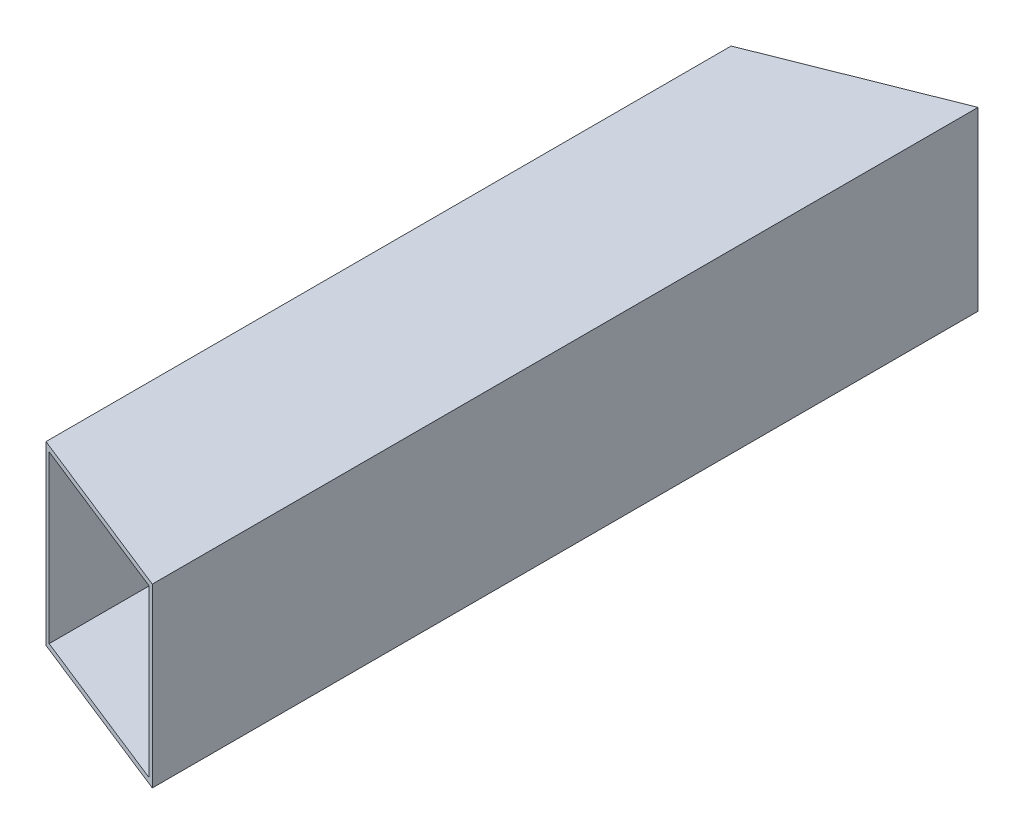
ISO-10303-21;
HEADER;
FILE_DESCRIPTION(('STEP AP214'),'2;1');
FILE_NAME('part.step','',(''),(''),'','','');
FILE_SCHEMA(('AUTOMOTIVE_DESIGN { 1 0 10303 214 1 1 1 1 }'));
ENDSEC;
DATA;
#1=APPLICATION_CONTEXT('core data for automotive mechanical design processes');
#2=APPLICATION_PROTOCOL_DEFINITION('international standard','automotive_design',2000,#1);
#3=PRODUCT_CONTEXT('',#1,'mechanical');
#4=PRODUCT('Part','Part','',(#3));
#5=PRODUCT_RELATED_PRODUCT_CATEGORY('part','',(#4));
#6=PRODUCT_DEFINITION_FORMATION('','',#4);
#7=PRODUCT_DEFINITION_CONTEXT('part definition',#1,'design');
#8=PRODUCT_DEFINITION('design','',#6,#7);
#9=PRODUCT_DEFINITION_SHAPE('','',#8);
#10=(LENGTH_UNIT() NAMED_UNIT(*) SI_UNIT(.MILLI.,.METRE.));
#11=(NAMED_UNIT(*) PLANE_ANGLE_UNIT() SI_UNIT($,.RADIAN.));
#12=(NAMED_UNIT(*) SI_UNIT($,.STERADIAN.) SOLID_ANGLE_UNIT());
#13=UNCERTAINTY_MEASURE_WITH_UNIT(LENGTH_MEASURE(1.E-05),#10,'distance_accuracy_value','');
#14=(GEOMETRIC_REPRESENTATION_CONTEXT(3) GLOBAL_UNCERTAINTY_ASSIGNED_CONTEXT((#13)) GLOBAL_UNIT_ASSIGNED_CONTEXT((#10,
#11,#12)) REPRESENTATION_CONTEXT('',''));
#15=CARTESIAN_POINT('',(0.,0.,0.));
#16=DIRECTION('',(0.,0.,1.));
#17=DIRECTION('',(1.,0.,0.));
#18=AXIS2_PLACEMENT_3D('',#15,#16,#17);
#19=CARTESIAN_POINT('',(-15.9452234480182,15.9452234480182,149.11688245));
#20=DIRECTION('',(0.,-1.,0.));
#21=DIRECTION('',(0.,0.,-1.));
#22=AXIS2_PLACEMENT_3D('',#19,#20,#21);
#23=PLANE('',#22);
#24=DIRECTION('',(0.,0.,-1.));
#25=VECTOR('',#24,1.);
#26=CARTESIAN_POINT('',(-15.9452234480182,15.9452234480182,149.11688245));
#27=LINE('',#26,#25);
#28=CARTESIAN_POINT('',(-15.9452234480182,15.9452234480182,136.424287616364));
#29=VERTEX_POINT('',#28);
#30=CARTESIAN_POINT('',(-15.9452234480182,15.9452234480182,12.6925948336361));
#31=VERTEX_POINT('',#30);
#32=EDGE_CURVE('E119',#29,#31,#27,.T.);
#33=ORIENTED_EDGE('',*,*,#32,.F.);
#34=DIRECTION('',(0.92911410701226,0.,0.369793153196229));
#35=VECTOR('',#34,1.);
#36=CARTESIAN_POINT('',(-11.5843012668873,15.9452234480182,138.159961579371));
#37=LINE('',#36,#35);
#38=CARTESIAN_POINT('',(15.9452234480182,15.9452259480182,149.11688245));
#39=VERTEX_POINT('',#38);
#40=EDGE_CURVE('E104',#29,#39,#37,.T.);
#41=ORIENTED_EDGE('',*,*,#40,.T.);
#42=DIRECTION('',(0.,0.,-1.));
#43=VECTOR('',#42,1.);
#44=CARTESIAN_POINT('',(15.9452234480182,15.9452234480182,149.11688245));
#45=LINE('',#44,#43);
#46=CARTESIAN_POINT('',(15.9452234480182,15.9452234480182,0.));
#47=VERTEX_POINT('',#46);
#48=EDGE_CURVE('E42',#39,#47,#45,.T.);
#49=ORIENTED_EDGE('',*,*,#48,.T.);
#50=DIRECTION('',(0.92911410701226,0.,-0.369793153196229));
#51=VECTOR('',#50,1.);
#52=CARTESIAN_POINT('',(-62.8178850045487,15.9452234480182,31.3482036387022));
#53=LINE('',#52,#51);
#54=EDGE_CURVE('E152',#31,#47,#53,.T.);
#55=ORIENTED_EDGE('',*,*,#54,.F.);
#56=EDGE_LOOP('',(#33,#41,#49,#55));
#57=FACE_BOUND('',#56,.T.);
#58=ADVANCED_FACE('F33',(#57),#23,.F.);
#59=CARTESIAN_POINT('',(-15.9452234480182,-15.9452234480182,149.11688245));
#60=DIRECTION('',(1.,0.,0.));
#61=DIRECTION('',(0.,0.,-1.));
#62=AXIS2_PLACEMENT_3D('',#59,#60,#61);
#63=PLANE('',#62);
#64=DIRECTION('',(0.,0.,-1.));
#65=VECTOR('',#64,1.);
#66=CARTESIAN_POINT('',(-15.9452234480182,-15.9452234480182,149.11688245));
#67=LINE('',#66,#65);
#68=CARTESIAN_POINT('',(-15.9452234480182,-15.9452234480182,136.424287616364));
#69=VERTEX_POINT('',#68);
#70=CARTESIAN_POINT('',(-15.9452234480182,-15.9452234480182,12.6925948336361));
#71=VERTEX_POINT('',#70);
#72=EDGE_CURVE('E123',#69,#71,#67,.T.);
#73=ORIENTED_EDGE('',*,*,#72,.F.);
#74=DIRECTION('',(0.,1.,0.));
#75=VECTOR('',#74,1.);
#76=CARTESIAN_POINT('',(-15.9452234480182,-15.9452484480182,136.424287616364));
#77=LINE('',#76,#75);
#78=EDGE_CURVE('E171',#69,#29,#77,.T.);
#79=ORIENTED_EDGE('',*,*,#78,.T.);
#80=ORIENTED_EDGE('',*,*,#32,.T.);
#81=DIRECTION('',(0.,1.,0.));
#82=VECTOR('',#81,1.);
#83=CARTESIAN_POINT('',(-15.9452234480182,-15.9452234480182,12.6925948336361));
#84=LINE('',#83,#82);
#85=EDGE_CURVE('E141',#71,#31,#84,.T.);
#86=ORIENTED_EDGE('',*,*,#85,.F.);
#87=EDGE_LOOP('',(#73,#79,#80,#86));
#88=FACE_BOUND('',#87,.T.);
#89=ADVANCED_FACE('F170',(#88),#63,.F.);
#90=CARTESIAN_POINT('',(-15.9452234480182,-15.9452234480182,149.11688245));
#91=DIRECTION('',(0.,1.,0.));
#92=DIRECTION('',(0.,0.,1.));
#93=AXIS2_PLACEMENT_3D('',#90,#91,#92);
#94=PLANE('',#93);
#95=DIRECTION('',(0.,0.,-1.));
#96=VECTOR('',#95,1.);
#97=CARTESIAN_POINT('',(15.9452234480182,-15.9452234480182,149.11688245));
#98=LINE('',#97,#96);
#99=CARTESIAN_POINT('',(15.9452234480182,-15.9452259480182,149.11688245));
#100=VERTEX_POINT('',#99);
#101=CARTESIAN_POINT('',(15.9452234480182,-15.9452234480182,0.));
#102=VERTEX_POINT('',#101);
#103=EDGE_CURVE('E112',#100,#102,#98,.T.);
#104=ORIENTED_EDGE('',*,*,#103,.F.);
#105=DIRECTION('',(-0.92911410701226,0.,-0.369793153196229));
#106=VECTOR('',#105,1.);
#107=CARTESIAN_POINT('',(-11.5843012668873,-15.9452234480182,138.159961579371));
#108=LINE('',#107,#106);
#109=EDGE_CURVE('E107',#100,#69,#108,.T.);
#110=ORIENTED_EDGE('',*,*,#109,.T.);
#111=ORIENTED_EDGE('',*,*,#72,.T.);
#112=DIRECTION('',(-0.92911410701226,0.,0.369793153196229));
#113=VECTOR('',#112,1.);
#114=CARTESIAN_POINT('',(2.18046109056548,-15.9452234480182,5.47846043531448));
#115=LINE('',#114,#113);
#116=EDGE_CURVE('E120',#102,#71,#115,.T.);
#117=ORIENTED_EDGE('',*,*,#116,.F.);
#118=EDGE_LOOP('',(#104,#110,#111,#117));
#119=FACE_BOUND('',#118,.T.);
#120=ADVANCED_FACE('F165',(#119),#94,.F.);
#121=CARTESIAN_POINT('',(15.,-15.,149.11688245));
#122=DIRECTION('',(-1.,0.,0.));
#123=DIRECTION('',(0.,0.,1.));
#124=AXIS2_PLACEMENT_3D('',#121,#122,#123);
#125=PLANE('',#124);
#126=DIRECTION('',(0.,-1.,0.));
#127=VECTOR('',#126,1.);
#128=CARTESIAN_POINT('',(15.,-15.,148.740677679585));
#129=LINE('',#128,#127);
#130=CARTESIAN_POINT('',(15.,15.,148.740677679585));
#131=VERTEX_POINT('',#130);
#132=CARTESIAN_POINT('',(15.,-15.,148.740677679585));
#133=VERTEX_POINT('',#132);
#134=EDGE_CURVE('E50',#131,#133,#129,.T.);
#135=ORIENTED_EDGE('',*,*,#134,.F.);
#136=DIRECTION('',(0.,0.,-1.));
#137=VECTOR('',#136,1.);
#138=CARTESIAN_POINT('',(15.,15.,149.11688245));
#139=LINE('',#138,#137);
#140=CARTESIAN_POINT('',(15.,15.,0.376204770414758));
#141=VERTEX_POINT('',#140);
#142=EDGE_CURVE('E129',#131,#141,#139,.T.);
#143=ORIENTED_EDGE('',*,*,#142,.T.);
#144=DIRECTION('',(0.,-1.,0.));
#145=VECTOR('',#144,1.);
#146=CARTESIAN_POINT('',(15.,-15.,0.376204770414751));
#147=LINE('',#146,#145);
#148=CARTESIAN_POINT('',(15.,-15.,0.376204770414758));
#149=VERTEX_POINT('',#148);
#150=EDGE_CURVE('E149',#141,#149,#147,.T.);
#151=ORIENTED_EDGE('',*,*,#150,.T.);
#152=DIRECTION('',(0.,0.,-1.));
#153=VECTOR('',#152,1.);
#154=CARTESIAN_POINT('',(15.,-15.,149.11688245));
#155=LINE('',#154,#153);
#156=EDGE_CURVE('E154',#133,#149,#155,.T.);
#157=ORIENTED_EDGE('',*,*,#156,.F.);
#158=EDGE_LOOP('',(#135,#143,#151,#157));
#159=FACE_BOUND('',#158,.T.);
#160=ADVANCED_FACE('F186',(#159),#125,.T.);
#161=CARTESIAN_POINT('',(-15.,15.,149.11688245));
#162=DIRECTION('',(0.,-1.,0.));
#163=DIRECTION('',(0.,0.,-1.));
#164=AXIS2_PLACEMENT_3D('',#161,#162,#163);
#165=PLANE('',#164);
#166=DIRECTION('',(0.92911410701226,0.,0.369793153196229));
#167=VECTOR('',#166,1.);
#168=CARTESIAN_POINT('',(-10.7683342671724,15.,138.484721485018));
#169=LINE('',#168,#167);
#170=CARTESIAN_POINT('',(-15.,15.,136.800492386779));
#171=VERTEX_POINT('',#170);
#172=EDGE_CURVE('E178',#171,#131,#169,.T.);
#173=ORIENTED_EDGE('',*,*,#172,.F.);
#174=DIRECTION('',(0.,0.,-1.));
#175=VECTOR('',#174,1.);
#176=CARTESIAN_POINT('',(-15.,15.,149.11688245));
#177=LINE('',#176,#175);
#178=CARTESIAN_POINT('',(-15.,15.,12.3163900632213));
#179=VERTEX_POINT('',#178);
#180=EDGE_CURVE('E159',#171,#179,#177,.T.);
#181=ORIENTED_EDGE('',*,*,#180,.T.);
#182=DIRECTION('',(0.92911410701226,0.,-0.369793153196229));
#183=VECTOR('',#182,1.);
#184=CARTESIAN_POINT('',(-62.0019180048338,15.,31.0234437330552));
#185=LINE('',#184,#183);
#186=EDGE_CURVE('E146',#179,#141,#185,.T.);
#187=ORIENTED_EDGE('',*,*,#186,.T.);
#188=ORIENTED_EDGE('',*,*,#142,.F.);
#189=EDGE_LOOP('',(#173,#181,#187,#188));
#190=FACE_BOUND('',#189,.T.);
#191=ADVANCED_FACE('F188',(#190),#165,.T.);
#192=CARTESIAN_POINT('',(-15.,-15.,149.11688245));
#193=DIRECTION('',(1.,0.,0.));
#194=DIRECTION('',(0.,0.,-1.));
#195=AXIS2_PLACEMENT_3D('',#192,#193,#194);
#196=PLANE('',#195);
#197=DIRECTION('',(0.,1.,0.));
#198=VECTOR('',#197,1.);
#199=CARTESIAN_POINT('',(-15.,-15.,136.800492386779));
#200=LINE('',#199,#198);
#201=CARTESIAN_POINT('',(-15.,-15.,136.800492386779));
#202=VERTEX_POINT('',#201);
#203=EDGE_CURVE('E174',#202,#171,#200,.T.);
#204=ORIENTED_EDGE('',*,*,#203,.F.);
#205=DIRECTION('',(0.,0.,-1.));
#206=VECTOR('',#205,1.);
#207=CARTESIAN_POINT('',(-15.,-15.,149.11688245));
#208=LINE('',#207,#206);
#209=CARTESIAN_POINT('',(-15.,-15.,12.3163900632213));
#210=VERTEX_POINT('',#209);
#211=EDGE_CURVE('E58',#202,#210,#208,.T.);
#212=ORIENTED_EDGE('',*,*,#211,.T.);
#213=DIRECTION('',(0.,1.,0.));
#214=VECTOR('',#213,1.);
#215=CARTESIAN_POINT('',(-15.,-15.,12.3163900632213));
#216=LINE('',#215,#214);
#217=EDGE_CURVE('E144',#210,#179,#216,.T.);
#218=ORIENTED_EDGE('',*,*,#217,.T.);
#219=ORIENTED_EDGE('',*,*,#180,.F.);
#220=EDGE_LOOP('',(#204,#212,#218,#219));
#221=FACE_BOUND('',#220,.T.);
#222=ADVANCED_FACE('F192',(#221),#196,.T.);
#223=CARTESIAN_POINT('',(-15.,-15.,149.11688245));
#224=DIRECTION('',(0.,1.,0.));
#225=DIRECTION('',(0.,0.,1.));
#226=AXIS2_PLACEMENT_3D('',#223,#224,#225);
#227=PLANE('',#226);
#228=DIRECTION('',(-0.92911410701226,0.,-0.369793153196229));
#229=VECTOR('',#228,1.);
#230=CARTESIAN_POINT('',(-10.7683342671724,-15.,138.484721485018));
#231=LINE('',#230,#229);
#232=EDGE_CURVE('E172',#133,#202,#231,.T.);
#233=ORIENTED_EDGE('',*,*,#232,.F.);
#234=ORIENTED_EDGE('',*,*,#156,.T.);
#235=DIRECTION('',(-0.92911410701226,0.,0.369793153196229));
#236=VECTOR('',#235,1.);
#237=CARTESIAN_POINT('',(-62.0019180048338,-15.,31.0234437330552));
#238=LINE('',#237,#236);
#239=EDGE_CURVE('E11',#149,#210,#238,.T.);
#240=ORIENTED_EDGE('',*,*,#239,.T.);
#241=ORIENTED_EDGE('',*,*,#211,.F.);
#242=EDGE_LOOP('',(#233,#234,#240,#241));
#243=FACE_BOUND('',#242,.T.);
#244=ADVANCED_FACE('F194',(#243),#227,.T.);
#245=CARTESIAN_POINT('',(15.9452234480182,-15.9452234480182,149.11688245));
#246=DIRECTION('',(-1.,0.,0.));
#247=DIRECTION('',(0.,0.,1.));
#248=AXIS2_PLACEMENT_3D('',#245,#246,#247);
#249=PLANE('',#248);
#250=DIRECTION('',(0.,1.,0.));
#251=VECTOR('',#250,1.);
#252=CARTESIAN_POINT('',(15.9452234480182,-15.9452234480182,0.));
#253=LINE('',#252,#251);
#254=EDGE_CURVE('E113',#102,#47,#253,.T.);
#255=ORIENTED_EDGE('',*,*,#254,.T.);
#256=ORIENTED_EDGE('',*,*,#48,.F.);
#257=DIRECTION('',(0.,1.,0.));
#258=VECTOR('',#257,1.);
#259=CARTESIAN_POINT('',(15.9452234480182,-15.9452234480182,149.11688245));
#260=LINE('',#259,#258);
#261=EDGE_CURVE('E101',#100,#39,#260,.T.);
#262=ORIENTED_EDGE('',*,*,#261,.F.);
#263=ORIENTED_EDGE('',*,*,#103,.T.);
#264=EDGE_LOOP('',(#255,#256,#262,#263));
#265=FACE_BOUND('',#264,.T.);
#266=ADVANCED_FACE('F35',(#265),#249,.F.);
#267=CARTESIAN_POINT('',(2.18046109056548,-15.9452234480182,5.47846043531448));
#268=DIRECTION('',(-0.369793153196229,0.,-0.92911410701226));
#269=DIRECTION('',(-0.92911410701226,0.,0.369793153196229));
#270=AXIS2_PLACEMENT_3D('',#267,#268,#269);
#271=PLANE('',#270);
#272=ORIENTED_EDGE('',*,*,#186,.F.);
#273=ORIENTED_EDGE('',*,*,#217,.F.);
#274=ORIENTED_EDGE('',*,*,#239,.F.);
#275=ORIENTED_EDGE('',*,*,#150,.F.);
#276=EDGE_LOOP('',(#272,#273,#274,#275));
#277=FACE_BOUND('',#276,.T.);
#278=ORIENTED_EDGE('',*,*,#54,.T.);
#279=ORIENTED_EDGE('',*,*,#254,.F.);
#280=ORIENTED_EDGE('',*,*,#116,.T.);
#281=ORIENTED_EDGE('',*,*,#85,.T.);
#282=EDGE_LOOP('',(#278,#279,#280,#281));
#283=FACE_BOUND('',#282,.T.);
#284=ADVANCED_FACE('F168',(#277,#283),#271,.T.);
#285=CARTESIAN_POINT('',(2.18046109056548,-15.9452484480182,143.638422014686));
#286=DIRECTION('',(0.369793153196229,0.,-0.92911410701226));
#287=DIRECTION('',(-0.92911410701226,0.,-0.369793153196229));
#288=AXIS2_PLACEMENT_3D('',#285,#286,#287);
#289=PLANE('',#288);
#290=ORIENTED_EDGE('',*,*,#134,.T.);
#291=ORIENTED_EDGE('',*,*,#232,.T.);
#292=ORIENTED_EDGE('',*,*,#203,.T.);
#293=ORIENTED_EDGE('',*,*,#172,.T.);
#294=EDGE_LOOP('',(#290,#291,#292,#293));
#295=FACE_BOUND('',#294,.T.);
#296=ORIENTED_EDGE('',*,*,#78,.F.);
#297=ORIENTED_EDGE('',*,*,#109,.F.);
#298=ORIENTED_EDGE('',*,*,#261,.T.);
#299=ORIENTED_EDGE('',*,*,#40,.F.);
#300=EDGE_LOOP('',(#296,#297,#298,#299));
#301=FACE_BOUND('',#300,.T.);
#302=ADVANCED_FACE('F103',(#295,#301),#289,.F.);
#303=CLOSED_SHELL('',(#58,#89,#120,#160,#191,#222,#244,#266,#284,#302));
#304=MANIFOLD_SOLID_BREP('B2',#303);
#305=ADVANCED_BREP_SHAPE_REPRESENTATION('',(#18,#304),#14);
#306=SHAPE_DEFINITION_REPRESENTATION(#9,#305);
ENDSEC;
END-ISO-10303-21;
